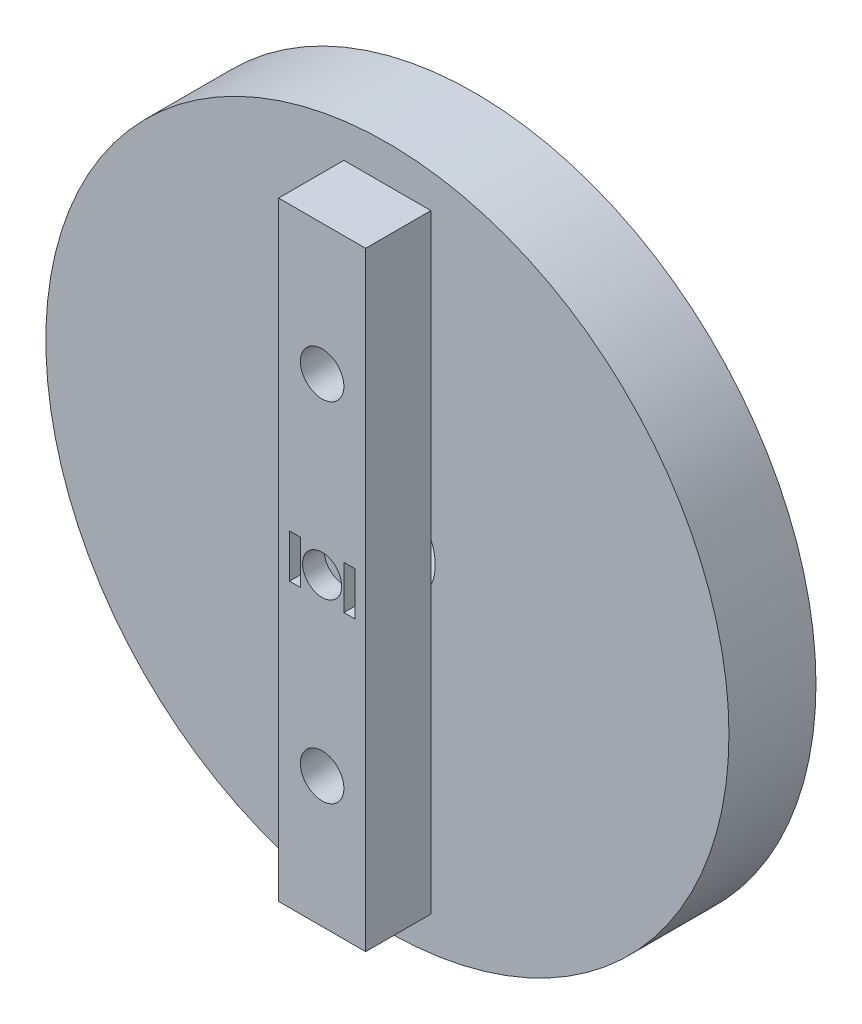
ISO-10303-21;
HEADER;
FILE_DESCRIPTION(('STEP AP214'),'2;1');
FILE_NAME('part.step','',(''),(''),'','','');
FILE_SCHEMA(('AUTOMOTIVE_DESIGN { 1 0 10303 214 1 1 1 1 }'));
ENDSEC;
DATA;
#1=APPLICATION_CONTEXT('core data for automotive mechanical design processes');
#2=APPLICATION_PROTOCOL_DEFINITION('international standard','automotive_design',2000,#1);
#3=PRODUCT_CONTEXT('',#1,'mechanical');
#4=PRODUCT('Part','Part','',(#3));
#5=PRODUCT_RELATED_PRODUCT_CATEGORY('part','',(#4));
#6=PRODUCT_DEFINITION_FORMATION('','',#4);
#7=PRODUCT_DEFINITION_CONTEXT('part definition',#1,'design');
#8=PRODUCT_DEFINITION('design','',#6,#7);
#9=PRODUCT_DEFINITION_SHAPE('','',#8);
#10=(LENGTH_UNIT() NAMED_UNIT(*) SI_UNIT(.MILLI.,.METRE.));
#11=(NAMED_UNIT(*) PLANE_ANGLE_UNIT() SI_UNIT($,.RADIAN.));
#12=(NAMED_UNIT(*) SI_UNIT($,.STERADIAN.) SOLID_ANGLE_UNIT());
#13=UNCERTAINTY_MEASURE_WITH_UNIT(LENGTH_MEASURE(1.E-05),#10,'distance_accuracy_value','');
#14=(GEOMETRIC_REPRESENTATION_CONTEXT(3) GLOBAL_UNCERTAINTY_ASSIGNED_CONTEXT((#13)) GLOBAL_UNIT_ASSIGNED_CONTEXT((#10,
#11,#12)) REPRESENTATION_CONTEXT('',''));
#15=CARTESIAN_POINT('',(0.,0.,0.));
#16=DIRECTION('',(0.,0.,1.));
#17=DIRECTION('',(1.,0.,0.));
#18=AXIS2_PLACEMENT_3D('',#15,#16,#17);
#19=CARTESIAN_POINT('',(0.,0.,7.));
#20=DIRECTION('',(0.,0.,1.));
#21=DIRECTION('',(1.,0.,0.));
#22=AXIS2_PLACEMENT_3D('',#19,#20,#21);
#23=PLANE('',#22);
#24=CARTESIAN_POINT('',(0.,8.,7.));
#25=DIRECTION('',(0.,0.,1.));
#26=DIRECTION('',(1.,0.,0.));
#27=AXIS2_PLACEMENT_3D('',#24,#25,#26);
#28=CIRCLE('',#27,1.);
#29=CARTESIAN_POINT('',(1.,8.,7.));
#30=VERTEX_POINT('',#29);
#31=EDGE_CURVE('E241',#30,#30,#28,.T.);
#32=ORIENTED_EDGE('',*,*,#31,.F.);
#33=EDGE_LOOP('',(#32));
#34=FACE_BOUND('',#33,.T.);
#35=CARTESIAN_POINT('',(0.,-8.,7.));
#36=DIRECTION('',(0.,0.,1.));
#37=DIRECTION('',(1.,0.,0.));
#38=AXIS2_PLACEMENT_3D('',#35,#36,#37);
#39=CIRCLE('',#38,1.);
#40=CARTESIAN_POINT('',(1.,-8.,7.));
#41=VERTEX_POINT('',#40);
#42=EDGE_CURVE('E159',#41,#41,#39,.T.);
#43=ORIENTED_EDGE('',*,*,#42,.F.);
#44=EDGE_LOOP('',(#43));
#45=FACE_BOUND('',#44,.T.);
#46=DIRECTION('',(1.,0.,0.));
#47=VECTOR('',#46,1.);
#48=CARTESIAN_POINT('',(1.,-1.,7.));
#49=LINE('',#48,#47);
#50=CARTESIAN_POINT('',(1.,-1.,7.));
#51=VERTEX_POINT('',#50);
#52=CARTESIAN_POINT('',(1.5,-1.,7.));
#53=VERTEX_POINT('',#52);
#54=EDGE_CURVE('E57',#51,#53,#49,.T.);
#55=ORIENTED_EDGE('',*,*,#54,.F.);
#56=DIRECTION('',(0.,-1.,0.));
#57=VECTOR('',#56,1.);
#58=CARTESIAN_POINT('',(1.,1.,7.));
#59=LINE('',#58,#57);
#60=CARTESIAN_POINT('',(1.,1.,7.));
#61=VERTEX_POINT('',#60);
#62=EDGE_CURVE('E153',#61,#51,#59,.T.);
#63=ORIENTED_EDGE('',*,*,#62,.F.);
#64=DIRECTION('',(1.,0.,0.));
#65=VECTOR('',#64,1.);
#66=CARTESIAN_POINT('',(1.,1.,7.));
#67=LINE('',#66,#65);
#68=CARTESIAN_POINT('',(1.5,1.,7.));
#69=VERTEX_POINT('',#68);
#70=EDGE_CURVE('E156',#61,#69,#67,.T.);
#71=ORIENTED_EDGE('',*,*,#70,.T.);
#72=DIRECTION('',(0.,-1.,0.));
#73=VECTOR('',#72,1.);
#74=CARTESIAN_POINT('',(1.5,1.,7.));
#75=LINE('',#74,#73);
#76=EDGE_CURVE('E165',#69,#53,#75,.T.);
#77=ORIENTED_EDGE('',*,*,#76,.T.);
#78=EDGE_LOOP('',(#55,#63,#71,#77));
#79=FACE_BOUND('',#78,.T.);
#80=CARTESIAN_POINT('',(0.,0.,7.));
#81=DIRECTION('',(0.,0.,1.));
#82=DIRECTION('',(1.,0.,0.));
#83=AXIS2_PLACEMENT_3D('',#80,#81,#82);
#84=CIRCLE('',#83,0.9);
#85=CARTESIAN_POINT('',(0.9,0.,7.));
#86=VERTEX_POINT('',#85);
#87=EDGE_CURVE('E206',#86,#86,#84,.T.);
#88=ORIENTED_EDGE('',*,*,#87,.F.);
#89=EDGE_LOOP('',(#88));
#90=FACE_BOUND('',#89,.T.);
#91=DIRECTION('',(0.,-1.,0.));
#92=VECTOR('',#91,1.);
#93=CARTESIAN_POINT('',(-2.,14.,7.));
#94=LINE('',#93,#92);
#95=CARTESIAN_POINT('',(-2.,14.,7.));
#96=VERTEX_POINT('',#95);
#97=CARTESIAN_POINT('',(-2.,-14.,7.));
#98=VERTEX_POINT('',#97);
#99=EDGE_CURVE('E215',#96,#98,#94,.T.);
#100=ORIENTED_EDGE('',*,*,#99,.T.);
#101=DIRECTION('',(1.,0.,0.));
#102=VECTOR('',#101,1.);
#103=CARTESIAN_POINT('',(-2.,-14.,7.));
#104=LINE('',#103,#102);
#105=CARTESIAN_POINT('',(2.,-14.,7.));
#106=VERTEX_POINT('',#105);
#107=EDGE_CURVE('E218',#98,#106,#104,.T.);
#108=ORIENTED_EDGE('',*,*,#107,.T.);
#109=DIRECTION('',(0.,1.,0.));
#110=VECTOR('',#109,1.);
#111=CARTESIAN_POINT('',(2.,14.,7.));
#112=LINE('',#111,#110);
#113=CARTESIAN_POINT('',(2.,14.,7.));
#114=VERTEX_POINT('',#113);
#115=EDGE_CURVE('E221',#106,#114,#112,.T.);
#116=ORIENTED_EDGE('',*,*,#115,.T.);
#117=DIRECTION('',(-1.,0.,0.));
#118=VECTOR('',#117,1.);
#119=CARTESIAN_POINT('',(-2.,14.,7.));
#120=LINE('',#119,#118);
#121=EDGE_CURVE('E223',#114,#96,#120,.T.);
#122=ORIENTED_EDGE('',*,*,#121,.T.);
#123=EDGE_LOOP('',(#100,#108,#116,#122));
#124=FACE_BOUND('',#123,.T.);
#125=DIRECTION('',(0.,-1.,0.));
#126=VECTOR('',#125,1.);
#127=CARTESIAN_POINT('',(-1.,1.,7.));
#128=LINE('',#127,#126);
#129=CARTESIAN_POINT('',(-1.,1.,7.));
#130=VERTEX_POINT('',#129);
#131=CARTESIAN_POINT('',(-1.,-1.,7.));
#132=VERTEX_POINT('',#131);
#133=EDGE_CURVE('E184',#130,#132,#128,.T.);
#134=ORIENTED_EDGE('',*,*,#133,.T.);
#135=DIRECTION('',(-1.,0.,0.));
#136=VECTOR('',#135,1.);
#137=CARTESIAN_POINT('',(-1.,-1.,7.));
#138=LINE('',#137,#136);
#139=CARTESIAN_POINT('',(-1.5,-1.,7.));
#140=VERTEX_POINT('',#139);
#141=EDGE_CURVE('E65',#132,#140,#138,.T.);
#142=ORIENTED_EDGE('',*,*,#141,.T.);
#143=DIRECTION('',(0.,-1.,0.));
#144=VECTOR('',#143,1.);
#145=CARTESIAN_POINT('',(-1.5,1.,7.));
#146=LINE('',#145,#144);
#147=CARTESIAN_POINT('',(-1.5,1.,7.));
#148=VERTEX_POINT('',#147);
#149=EDGE_CURVE('E191',#148,#140,#146,.T.);
#150=ORIENTED_EDGE('',*,*,#149,.F.);
#151=DIRECTION('',(-1.,0.,0.));
#152=VECTOR('',#151,1.);
#153=CARTESIAN_POINT('',(-1.,1.,7.));
#154=LINE('',#153,#152);
#155=EDGE_CURVE('E187',#130,#148,#154,.T.);
#156=ORIENTED_EDGE('',*,*,#155,.F.);
#157=EDGE_LOOP('',(#134,#142,#150,#156));
#158=FACE_BOUND('',#157,.T.);
#159=ADVANCED_FACE('F40',(#34,#45,#79,#90,#124,#158),#23,.T.);
#160=CARTESIAN_POINT('',(0.,0.,4.));
#161=DIRECTION('',(0.,0.,1.));
#162=DIRECTION('',(1.,0.,0.));
#163=AXIS2_PLACEMENT_3D('',#160,#161,#162);
#164=PLANE('',#163);
#165=CARTESIAN_POINT('',(0.,8.,4.));
#166=DIRECTION('',(0.,0.,1.));
#167=DIRECTION('',(1.,0.,0.));
#168=AXIS2_PLACEMENT_3D('',#165,#166,#167);
#169=CIRCLE('',#168,1.);
#170=CARTESIAN_POINT('',(1.,8.,4.));
#171=VERTEX_POINT('',#170);
#172=EDGE_CURVE('E44',#171,#171,#169,.T.);
#173=ORIENTED_EDGE('',*,*,#172,.T.);
#174=EDGE_LOOP('',(#173));
#175=FACE_BOUND('',#174,.T.);
#176=CARTESIAN_POINT('',(0.,-8.,4.));
#177=DIRECTION('',(0.,0.,1.));
#178=DIRECTION('',(1.,0.,0.));
#179=AXIS2_PLACEMENT_3D('',#176,#177,#178);
#180=CIRCLE('',#179,1.);
#181=CARTESIAN_POINT('',(1.,-8.,4.));
#182=VERTEX_POINT('',#181);
#183=EDGE_CURVE('E239',#182,#182,#180,.T.);
#184=ORIENTED_EDGE('',*,*,#183,.T.);
#185=EDGE_LOOP('',(#184));
#186=FACE_BOUND('',#185,.T.);
#187=DIRECTION('',(0.,-1.,0.));
#188=VECTOR('',#187,1.);
#189=CARTESIAN_POINT('',(1.,1.,4.));
#190=LINE('',#189,#188);
#191=CARTESIAN_POINT('',(1.,1.,4.));
#192=VERTEX_POINT('',#191);
#193=CARTESIAN_POINT('',(1.,-1.,4.));
#194=VERTEX_POINT('',#193);
#195=EDGE_CURVE('E148',#192,#194,#190,.T.);
#196=ORIENTED_EDGE('',*,*,#195,.T.);
#197=DIRECTION('',(1.,0.,0.));
#198=VECTOR('',#197,1.);
#199=CARTESIAN_POINT('',(1.,-1.,4.));
#200=LINE('',#199,#198);
#201=CARTESIAN_POINT('',(1.5,-1.,4.));
#202=VERTEX_POINT('',#201);
#203=EDGE_CURVE('E143',#194,#202,#200,.T.);
#204=ORIENTED_EDGE('',*,*,#203,.T.);
#205=DIRECTION('',(0.,-1.,0.));
#206=VECTOR('',#205,1.);
#207=CARTESIAN_POINT('',(1.5,1.,4.));
#208=LINE('',#207,#206);
#209=CARTESIAN_POINT('',(1.5,1.,4.));
#210=VERTEX_POINT('',#209);
#211=EDGE_CURVE('E132',#210,#202,#208,.T.);
#212=ORIENTED_EDGE('',*,*,#211,.F.);
#213=DIRECTION('',(1.,0.,0.));
#214=VECTOR('',#213,1.);
#215=CARTESIAN_POINT('',(1.,1.,4.));
#216=LINE('',#215,#214);
#217=EDGE_CURVE('E142',#192,#210,#216,.T.);
#218=ORIENTED_EDGE('',*,*,#217,.F.);
#219=EDGE_LOOP('',(#196,#204,#212,#218));
#220=FACE_BOUND('',#219,.T.);
#221=DIRECTION('',(0.,-1.,0.));
#222=VECTOR('',#221,1.);
#223=CARTESIAN_POINT('',(-2.,14.,4.));
#224=LINE('',#223,#222);
#225=CARTESIAN_POINT('',(-2.,14.,4.));
#226=VERTEX_POINT('',#225);
#227=CARTESIAN_POINT('',(-2.,-14.,4.));
#228=VERTEX_POINT('',#227);
#229=EDGE_CURVE('E212',#226,#228,#224,.T.);
#230=ORIENTED_EDGE('',*,*,#229,.F.);
#231=DIRECTION('',(-1.,0.,0.));
#232=VECTOR('',#231,1.);
#233=CARTESIAN_POINT('',(-2.,14.,4.));
#234=LINE('',#233,#232);
#235=CARTESIAN_POINT('',(2.,14.,4.));
#236=VERTEX_POINT('',#235);
#237=EDGE_CURVE('E219',#236,#226,#234,.T.);
#238=ORIENTED_EDGE('',*,*,#237,.F.);
#239=DIRECTION('',(0.,1.,0.));
#240=VECTOR('',#239,1.);
#241=CARTESIAN_POINT('',(2.,14.,4.));
#242=LINE('',#241,#240);
#243=CARTESIAN_POINT('',(2.,-14.,4.));
#244=VERTEX_POINT('',#243);
#245=EDGE_CURVE('E230',#244,#236,#242,.T.);
#246=ORIENTED_EDGE('',*,*,#245,.F.);
#247=DIRECTION('',(1.,0.,0.));
#248=VECTOR('',#247,1.);
#249=CARTESIAN_POINT('',(-2.,-14.,4.));
#250=LINE('',#249,#248);
#251=EDGE_CURVE('E228',#228,#244,#250,.T.);
#252=ORIENTED_EDGE('',*,*,#251,.F.);
#253=EDGE_LOOP('',(#230,#238,#246,#252));
#254=FACE_BOUND('',#253,.T.);
#255=CARTESIAN_POINT('',(0.,0.,4.));
#256=DIRECTION('',(0.,0.,1.));
#257=DIRECTION('',(1.,0.,0.));
#258=AXIS2_PLACEMENT_3D('',#255,#256,#257);
#259=CIRCLE('',#258,0.4);
#260=CARTESIAN_POINT('',(0.4,0.,4.));
#261=VERTEX_POINT('',#260);
#262=EDGE_CURVE('E203',#261,#261,#259,.T.);
#263=ORIENTED_EDGE('',*,*,#262,.T.);
#264=EDGE_LOOP('',(#263));
#265=FACE_BOUND('',#264,.T.);
#266=DIRECTION('',(-1.,0.,0.));
#267=VECTOR('',#266,1.);
#268=CARTESIAN_POINT('',(-1.,-1.,4.));
#269=LINE('',#268,#267);
#270=CARTESIAN_POINT('',(-1.,-1.,4.));
#271=VERTEX_POINT('',#270);
#272=CARTESIAN_POINT('',(-1.5,-1.,4.));
#273=VERTEX_POINT('',#272);
#274=EDGE_CURVE('E188',#271,#273,#269,.T.);
#275=ORIENTED_EDGE('',*,*,#274,.F.);
#276=DIRECTION('',(0.,-1.,0.));
#277=VECTOR('',#276,1.);
#278=CARTESIAN_POINT('',(-1.,1.,4.));
#279=LINE('',#278,#277);
#280=CARTESIAN_POINT('',(-1.,1.,4.));
#281=VERTEX_POINT('',#280);
#282=EDGE_CURVE('E183',#281,#271,#279,.T.);
#283=ORIENTED_EDGE('',*,*,#282,.F.);
#284=DIRECTION('',(-1.,0.,0.));
#285=VECTOR('',#284,1.);
#286=CARTESIAN_POINT('',(-1.,1.,4.));
#287=LINE('',#286,#285);
#288=CARTESIAN_POINT('',(-1.5,1.,4.));
#289=VERTEX_POINT('',#288);
#290=EDGE_CURVE('E196',#281,#289,#287,.T.);
#291=ORIENTED_EDGE('',*,*,#290,.T.);
#292=DIRECTION('',(0.,-1.,0.));
#293=VECTOR('',#292,1.);
#294=CARTESIAN_POINT('',(-1.5,1.,4.));
#295=LINE('',#294,#293);
#296=EDGE_CURVE('E199',#289,#273,#295,.T.);
#297=ORIENTED_EDGE('',*,*,#296,.T.);
#298=EDGE_LOOP('',(#275,#283,#291,#297));
#299=FACE_BOUND('',#298,.T.);
#300=ADVANCED_FACE('F150',(#175,#186,#220,#254,#265,#299),#164,.F.);
#301=CARTESIAN_POINT('',(-2.,14.,7.));
#302=DIRECTION('',(1.,0.,0.));
#303=DIRECTION('',(0.,0.,-1.));
#304=AXIS2_PLACEMENT_3D('',#301,#302,#303);
#305=PLANE('',#304);
#306=ORIENTED_EDGE('',*,*,#229,.T.);
#307=DIRECTION('',(0.,0.,-1.));
#308=VECTOR('',#307,1.);
#309=CARTESIAN_POINT('',(-2.,-14.,7.));
#310=LINE('',#309,#308);
#311=EDGE_CURVE('E12',#98,#228,#310,.T.);
#312=ORIENTED_EDGE('',*,*,#311,.F.);
#313=ORIENTED_EDGE('',*,*,#99,.F.);
#314=DIRECTION('',(0.,0.,-1.));
#315=VECTOR('',#314,1.);
#316=CARTESIAN_POINT('',(-2.,14.,7.));
#317=LINE('',#316,#315);
#318=EDGE_CURVE('E225',#96,#226,#317,.T.);
#319=ORIENTED_EDGE('',*,*,#318,.T.);
#320=EDGE_LOOP('',(#306,#312,#313,#319));
#321=FACE_BOUND('',#320,.T.);
#322=ADVANCED_FACE('F42',(#321),#305,.F.);
#323=CARTESIAN_POINT('',(-2.,-14.,7.));
#324=DIRECTION('',(0.,1.,0.));
#325=DIRECTION('',(0.,0.,1.));
#326=AXIS2_PLACEMENT_3D('',#323,#324,#325);
#327=PLANE('',#326);
#328=ORIENTED_EDGE('',*,*,#251,.T.);
#329=DIRECTION('',(0.,0.,-1.));
#330=VECTOR('',#329,1.);
#331=CARTESIAN_POINT('',(2.,-14.,7.));
#332=LINE('',#331,#330);
#333=EDGE_CURVE('E49',#106,#244,#332,.T.);
#334=ORIENTED_EDGE('',*,*,#333,.F.);
#335=ORIENTED_EDGE('',*,*,#107,.F.);
#336=ORIENTED_EDGE('',*,*,#311,.T.);
#337=EDGE_LOOP('',(#328,#334,#335,#336));
#338=FACE_BOUND('',#337,.T.);
#339=ADVANCED_FACE('F312',(#338),#327,.F.);
#340=CARTESIAN_POINT('',(2.,14.,7.));
#341=DIRECTION('',(-1.,0.,0.));
#342=DIRECTION('',(0.,-1.,0.));
#343=AXIS2_PLACEMENT_3D('',#340,#341,#342);
#344=PLANE('',#343);
#345=ORIENTED_EDGE('',*,*,#245,.T.);
#346=DIRECTION('',(0.,0.,-1.));
#347=VECTOR('',#346,1.);
#348=CARTESIAN_POINT('',(2.,14.,7.));
#349=LINE('',#348,#347);
#350=EDGE_CURVE('E235',#114,#236,#349,.T.);
#351=ORIENTED_EDGE('',*,*,#350,.F.);
#352=ORIENTED_EDGE('',*,*,#115,.F.);
#353=ORIENTED_EDGE('',*,*,#333,.T.);
#354=EDGE_LOOP('',(#345,#351,#352,#353));
#355=FACE_BOUND('',#354,.T.);
#356=ADVANCED_FACE('F309',(#355),#344,.F.);
#357=CARTESIAN_POINT('',(-2.,14.,7.));
#358=DIRECTION('',(0.,-1.,0.));
#359=DIRECTION('',(0.,0.,-1.));
#360=AXIS2_PLACEMENT_3D('',#357,#358,#359);
#361=PLANE('',#360);
#362=ORIENTED_EDGE('',*,*,#237,.T.);
#363=ORIENTED_EDGE('',*,*,#318,.F.);
#364=ORIENTED_EDGE('',*,*,#121,.F.);
#365=ORIENTED_EDGE('',*,*,#350,.T.);
#366=EDGE_LOOP('',(#362,#363,#364,#365));
#367=FACE_BOUND('',#366,.T.);
#368=ADVANCED_FACE('F301',(#367),#361,.F.);
#369=CARTESIAN_POINT('',(0.,0.,6.));
#370=DIRECTION('',(0.,0.,1.));
#371=DIRECTION('',(1.,0.,0.));
#372=AXIS2_PLACEMENT_3D('',#369,#370,#371);
#373=CYLINDRICAL_SURFACE('',#372,0.9);
#374=CARTESIAN_POINT('',(0.,0.,6.));
#375=DIRECTION('',(0.,0.,1.));
#376=DIRECTION('',(1.,0.,0.));
#377=AXIS2_PLACEMENT_3D('',#374,#375,#376);
#378=CIRCLE('',#377,0.9);
#379=CARTESIAN_POINT('',(0.9,0.,6.));
#380=VERTEX_POINT('',#379);
#381=EDGE_CURVE('E209',#380,#380,#378,.T.);
#382=ORIENTED_EDGE('',*,*,#381,.F.);
#383=EDGE_LOOP('',(#382));
#384=FACE_BOUND('',#383,.T.);
#385=ORIENTED_EDGE('',*,*,#87,.T.);
#386=EDGE_LOOP('',(#385));
#387=FACE_BOUND('',#386,.T.);
#388=ADVANCED_FACE('F298',(#384,#387),#373,.F.);
#389=CARTESIAN_POINT('',(0.,0.,6.));
#390=DIRECTION('',(0.,0.,1.));
#391=DIRECTION('',(1.,0.,0.));
#392=AXIS2_PLACEMENT_3D('',#389,#390,#391);
#393=PLANE('',#392);
#394=CARTESIAN_POINT('',(0.,0.,6.));
#395=DIRECTION('',(0.,0.,1.));
#396=DIRECTION('',(1.,0.,0.));
#397=AXIS2_PLACEMENT_3D('',#394,#395,#396);
#398=CIRCLE('',#397,0.4);
#399=CARTESIAN_POINT('',(0.4,0.,6.));
#400=VERTEX_POINT('',#399);
#401=EDGE_CURVE('E171',#400,#400,#398,.T.);
#402=ORIENTED_EDGE('',*,*,#401,.F.);
#403=EDGE_LOOP('',(#402));
#404=FACE_BOUND('',#403,.T.);
#405=ORIENTED_EDGE('',*,*,#381,.T.);
#406=EDGE_LOOP('',(#405));
#407=FACE_BOUND('',#406,.T.);
#408=ADVANCED_FACE('F294',(#404,#407),#393,.T.);
#409=CARTESIAN_POINT('',(0.,0.,4.));
#410=DIRECTION('',(0.,0.,1.));
#411=DIRECTION('',(1.,0.,0.));
#412=AXIS2_PLACEMENT_3D('',#409,#410,#411);
#413=CYLINDRICAL_SURFACE('',#412,0.4);
#414=ORIENTED_EDGE('',*,*,#262,.F.);
#415=EDGE_LOOP('',(#414));
#416=FACE_BOUND('',#415,.T.);
#417=ORIENTED_EDGE('',*,*,#401,.T.);
#418=EDGE_LOOP('',(#417));
#419=FACE_BOUND('',#418,.T.);
#420=ADVANCED_FACE('F291',(#416,#419),#413,.F.);
#421=CARTESIAN_POINT('',(-1.,-1.,4.));
#422=DIRECTION('',(0.,1.,0.));
#423=DIRECTION('',(0.,0.,1.));
#424=AXIS2_PLACEMENT_3D('',#421,#422,#423);
#425=PLANE('',#424);
#426=ORIENTED_EDGE('',*,*,#141,.F.);
#427=DIRECTION('',(0.,0.,1.));
#428=VECTOR('',#427,1.);
#429=CARTESIAN_POINT('',(-1.,-1.,4.));
#430=LINE('',#429,#428);
#431=EDGE_CURVE('E181',#271,#132,#430,.T.);
#432=ORIENTED_EDGE('',*,*,#431,.F.);
#433=ORIENTED_EDGE('',*,*,#274,.T.);
#434=DIRECTION('',(0.,0.,1.));
#435=VECTOR('',#434,1.);
#436=CARTESIAN_POINT('',(-1.5,-1.,4.));
#437=LINE('',#436,#435);
#438=EDGE_CURVE('E175',#273,#140,#437,.T.);
#439=ORIENTED_EDGE('',*,*,#438,.T.);
#440=EDGE_LOOP('',(#426,#432,#433,#439));
#441=FACE_BOUND('',#440,.T.);
#442=ADVANCED_FACE('F273',(#441),#425,.T.);
#443=CARTESIAN_POINT('',(-1.5,1.,4.));
#444=DIRECTION('',(-1.,0.,0.));
#445=DIRECTION('',(0.,-1.,0.));
#446=AXIS2_PLACEMENT_3D('',#443,#444,#445);
#447=PLANE('',#446);
#448=ORIENTED_EDGE('',*,*,#149,.T.);
#449=ORIENTED_EDGE('',*,*,#438,.F.);
#450=ORIENTED_EDGE('',*,*,#296,.F.);
#451=DIRECTION('',(0.,0.,1.));
#452=VECTOR('',#451,1.);
#453=CARTESIAN_POINT('',(-1.5,1.,4.));
#454=LINE('',#453,#452);
#455=EDGE_CURVE('E177',#289,#148,#454,.T.);
#456=ORIENTED_EDGE('',*,*,#455,.T.);
#457=EDGE_LOOP('',(#448,#449,#450,#456));
#458=FACE_BOUND('',#457,.T.);
#459=ADVANCED_FACE('F278',(#458),#447,.F.);
#460=CARTESIAN_POINT('',(-1.,1.,4.));
#461=DIRECTION('',(0.,1.,0.));
#462=DIRECTION('',(0.,0.,1.));
#463=AXIS2_PLACEMENT_3D('',#460,#461,#462);
#464=PLANE('',#463);
#465=ORIENTED_EDGE('',*,*,#155,.T.);
#466=ORIENTED_EDGE('',*,*,#455,.F.);
#467=ORIENTED_EDGE('',*,*,#290,.F.);
#468=DIRECTION('',(0.,0.,1.));
#469=VECTOR('',#468,1.);
#470=CARTESIAN_POINT('',(-1.,1.,4.));
#471=LINE('',#470,#469);
#472=EDGE_CURVE('E179',#281,#130,#471,.T.);
#473=ORIENTED_EDGE('',*,*,#472,.T.);
#474=EDGE_LOOP('',(#465,#466,#467,#473));
#475=FACE_BOUND('',#474,.T.);
#476=ADVANCED_FACE('F280',(#475),#464,.F.);
#477=CARTESIAN_POINT('',(-1.,1.,4.));
#478=DIRECTION('',(-1.,0.,0.));
#479=DIRECTION('',(0.,-1.,0.));
#480=AXIS2_PLACEMENT_3D('',#477,#478,#479);
#481=PLANE('',#480);
#482=ORIENTED_EDGE('',*,*,#133,.F.);
#483=ORIENTED_EDGE('',*,*,#472,.F.);
#484=ORIENTED_EDGE('',*,*,#282,.T.);
#485=ORIENTED_EDGE('',*,*,#431,.T.);
#486=EDGE_LOOP('',(#482,#483,#484,#485));
#487=FACE_BOUND('',#486,.T.);
#488=ADVANCED_FACE('F270',(#487),#481,.T.);
#489=CARTESIAN_POINT('',(1.,-1.,4.));
#490=DIRECTION('',(0.,-1.,0.));
#491=DIRECTION('',(1.,0.,0.));
#492=AXIS2_PLACEMENT_3D('',#489,#490,#491);
#493=PLANE('',#492);
#494=ORIENTED_EDGE('',*,*,#54,.T.);
#495=DIRECTION('',(0.,0.,1.));
#496=VECTOR('',#495,1.);
#497=CARTESIAN_POINT('',(1.5,-1.,4.));
#498=LINE('',#497,#496);
#499=EDGE_CURVE('E135',#202,#53,#498,.T.);
#500=ORIENTED_EDGE('',*,*,#499,.F.);
#501=ORIENTED_EDGE('',*,*,#203,.F.);
#502=DIRECTION('',(0.,0.,1.));
#503=VECTOR('',#502,1.);
#504=CARTESIAN_POINT('',(1.,-1.,4.));
#505=LINE('',#504,#503);
#506=EDGE_CURVE('E169',#194,#51,#505,.T.);
#507=ORIENTED_EDGE('',*,*,#506,.T.);
#508=EDGE_LOOP('',(#494,#500,#501,#507));
#509=FACE_BOUND('',#508,.T.);
#510=ADVANCED_FACE('F146',(#509),#493,.F.);
#511=CARTESIAN_POINT('',(1.,1.,4.));
#512=DIRECTION('',(-1.,0.,0.));
#513=DIRECTION('',(0.,0.,1.));
#514=AXIS2_PLACEMENT_3D('',#511,#512,#513);
#515=PLANE('',#514);
#516=ORIENTED_EDGE('',*,*,#62,.T.);
#517=ORIENTED_EDGE('',*,*,#506,.F.);
#518=ORIENTED_EDGE('',*,*,#195,.F.);
#519=DIRECTION('',(0.,0.,1.));
#520=VECTOR('',#519,1.);
#521=CARTESIAN_POINT('',(1.,1.,4.));
#522=LINE('',#521,#520);
#523=EDGE_CURVE('E172',#192,#61,#522,.T.);
#524=ORIENTED_EDGE('',*,*,#523,.T.);
#525=EDGE_LOOP('',(#516,#517,#518,#524));
#526=FACE_BOUND('',#525,.T.);
#527=ADVANCED_FACE('F367',(#526),#515,.F.);
#528=CARTESIAN_POINT('',(1.,1.,4.));
#529=DIRECTION('',(0.,-1.,0.));
#530=DIRECTION('',(0.,0.,-1.));
#531=AXIS2_PLACEMENT_3D('',#528,#529,#530);
#532=PLANE('',#531);
#533=ORIENTED_EDGE('',*,*,#70,.F.);
#534=ORIENTED_EDGE('',*,*,#523,.F.);
#535=ORIENTED_EDGE('',*,*,#217,.T.);
#536=DIRECTION('',(0.,0.,1.));
#537=VECTOR('',#536,1.);
#538=CARTESIAN_POINT('',(1.5,1.,4.));
#539=LINE('',#538,#537);
#540=EDGE_CURVE('E137',#210,#69,#539,.T.);
#541=ORIENTED_EDGE('',*,*,#540,.T.);
#542=EDGE_LOOP('',(#533,#534,#535,#541));
#543=FACE_BOUND('',#542,.T.);
#544=ADVANCED_FACE('F356',(#543),#532,.T.);
#545=CARTESIAN_POINT('',(1.5,1.,4.));
#546=DIRECTION('',(-1.,0.,0.));
#547=DIRECTION('',(0.,0.,1.));
#548=AXIS2_PLACEMENT_3D('',#545,#546,#547);
#549=PLANE('',#548);
#550=ORIENTED_EDGE('',*,*,#76,.F.);
#551=ORIENTED_EDGE('',*,*,#540,.F.);
#552=ORIENTED_EDGE('',*,*,#211,.T.);
#553=ORIENTED_EDGE('',*,*,#499,.T.);
#554=EDGE_LOOP('',(#550,#551,#552,#553));
#555=FACE_BOUND('',#554,.T.);
#556=ADVANCED_FACE('F134',(#555),#549,.T.);
#557=CARTESIAN_POINT('',(0.,-8.,2.));
#558=DIRECTION('',(0.,0.,1.));
#559=DIRECTION('',(1.,0.,0.));
#560=AXIS2_PLACEMENT_3D('',#557,#558,#559);
#561=CYLINDRICAL_SURFACE('',#560,1.);
#562=ORIENTED_EDGE('',*,*,#42,.T.);
#563=EDGE_LOOP('',(#562));
#564=FACE_BOUND('',#563,.T.);
#565=ORIENTED_EDGE('',*,*,#183,.F.);
#566=EDGE_LOOP('',(#565));
#567=FACE_BOUND('',#566,.T.);
#568=ADVANCED_FACE('F251',(#564,#567),#561,.F.);
#569=CARTESIAN_POINT('',(0.,8.,2.));
#570=DIRECTION('',(0.,0.,1.));
#571=DIRECTION('',(1.,0.,0.));
#572=AXIS2_PLACEMENT_3D('',#569,#570,#571);
#573=CYLINDRICAL_SURFACE('',#572,1.);
#574=ORIENTED_EDGE('',*,*,#31,.T.);
#575=EDGE_LOOP('',(#574));
#576=FACE_BOUND('',#575,.T.);
#577=ORIENTED_EDGE('',*,*,#172,.F.);
#578=EDGE_LOOP('',(#577));
#579=FACE_BOUND('',#578,.T.);
#580=ADVANCED_FACE('F451',(#576,#579),#573,.F.);
#581=CLOSED_SHELL('',(#159,#300,#322,#339,#356,#368,#388,#408,#420,#442,#459,#476,#488,#510,
#527,#544,#556,#568,#580));
#582=MANIFOLD_SOLID_BREP('B2',#581);
#583=CARTESIAN_POINT('',(0.,0.,4.));
#584=DIRECTION('',(0.,0.,-1.));
#585=DIRECTION('',(-1.,0.,0.));
#586=AXIS2_PLACEMENT_3D('',#583,#584,#585);
#587=CYLINDRICAL_SURFACE('',#586,15.7);
#588=CARTESIAN_POINT('',(0.,0.,4.));
#589=DIRECTION('',(0.,0.,1.));
#590=DIRECTION('',(1.,0.,0.));
#591=AXIS2_PLACEMENT_3D('',#588,#589,#590);
#592=CIRCLE('',#591,15.7);
#593=CARTESIAN_POINT('',(15.7,0.,4.));
#594=VERTEX_POINT('',#593);
#595=EDGE_CURVE('E39',#594,#594,#592,.T.);
#596=ORIENTED_EDGE('',*,*,#595,.F.);
#597=EDGE_LOOP('',(#596));
#598=FACE_BOUND('',#597,.T.);
#599=CARTESIAN_POINT('',(0.,0.,0.));
#600=DIRECTION('',(0.,0.,1.));
#601=DIRECTION('',(1.,0.,0.));
#602=AXIS2_PLACEMENT_3D('',#599,#600,#601);
#603=CIRCLE('',#602,15.7);
#604=CARTESIAN_POINT('',(15.7,0.,0.));
#605=VERTEX_POINT('',#604);
#606=EDGE_CURVE('E475',#605,#605,#603,.T.);
#607=ORIENTED_EDGE('',*,*,#606,.T.);
#608=EDGE_LOOP('',(#607));
#609=FACE_BOUND('',#608,.T.);
#610=ADVANCED_FACE('F468',(#598,#609),#587,.T.);
#611=CARTESIAN_POINT('',(0.,0.,4.));
#612=DIRECTION('',(0.,0.,1.));
#613=DIRECTION('',(1.,0.,0.));
#614=AXIS2_PLACEMENT_3D('',#611,#612,#613);
#615=PLANE('',#614);
#616=CARTESIAN_POINT('',(0.,8.,4.));
#617=DIRECTION('',(0.,0.,1.));
#618=DIRECTION('',(1.,0.,0.));
#619=AXIS2_PLACEMENT_3D('',#616,#617,#618);
#620=CIRCLE('',#619,1.);
#621=CARTESIAN_POINT('',(1.,8.,4.));
#622=VERTEX_POINT('',#621);
#623=EDGE_CURVE('E471',#622,#622,#620,.T.);
#624=ORIENTED_EDGE('',*,*,#623,.F.);
#625=EDGE_LOOP('',(#624));
#626=FACE_BOUND('',#625,.T.);
#627=CARTESIAN_POINT('',(0.,-8.,4.));
#628=DIRECTION('',(0.,0.,1.));
#629=DIRECTION('',(1.,0.,0.));
#630=AXIS2_PLACEMENT_3D('',#627,#628,#629);
#631=CIRCLE('',#630,1.);
#632=CARTESIAN_POINT('',(1.,-8.,4.));
#633=VERTEX_POINT('',#632);
#634=EDGE_CURVE('E485',#633,#633,#631,.T.);
#635=ORIENTED_EDGE('',*,*,#634,.F.);
#636=EDGE_LOOP('',(#635));
#637=FACE_BOUND('',#636,.T.);
#638=CARTESIAN_POINT('',(0.,0.,4.));
#639=DIRECTION('',(0.,0.,-1.));
#640=DIRECTION('',(-1.,0.,0.));
#641=AXIS2_PLACEMENT_3D('',#638,#639,#640);
#642=CIRCLE('',#641,2.2);
#643=CARTESIAN_POINT('',(-2.2,0.,4.));
#644=VERTEX_POINT('',#643);
#645=EDGE_CURVE('E480',#644,#644,#642,.T.);
#646=ORIENTED_EDGE('',*,*,#645,.T.);
#647=EDGE_LOOP('',(#646));
#648=FACE_BOUND('',#647,.T.);
#649=ORIENTED_EDGE('',*,*,#595,.T.);
#650=EDGE_LOOP('',(#649));
#651=FACE_BOUND('',#650,.T.);
#652=ADVANCED_FACE('F509',(#626,#637,#648,#651),#615,.T.);
#653=CARTESIAN_POINT('',(0.,0.,0.));
#654=DIRECTION('',(0.,0.,1.));
#655=DIRECTION('',(1.,0.,0.));
#656=AXIS2_PLACEMENT_3D('',#653,#654,#655);
#657=PLANE('',#656);
#658=CARTESIAN_POINT('',(0.,0.,0.));
#659=DIRECTION('',(0.,0.,-1.));
#660=DIRECTION('',(-1.,0.,0.));
#661=AXIS2_PLACEMENT_3D('',#658,#659,#660);
#662=CIRCLE('',#661,2.2);
#663=CARTESIAN_POINT('',(-2.2,0.,0.));
#664=VERTEX_POINT('',#663);
#665=EDGE_CURVE('E483',#664,#664,#662,.T.);
#666=ORIENTED_EDGE('',*,*,#665,.F.);
#667=EDGE_LOOP('',(#666));
#668=FACE_BOUND('',#667,.T.);
#669=ORIENTED_EDGE('',*,*,#606,.F.);
#670=EDGE_LOOP('',(#669));
#671=FACE_BOUND('',#670,.T.);
#672=ADVANCED_FACE('F506',(#668,#671),#657,.F.);
#673=CARTESIAN_POINT('',(0.,0.,4.));
#674=DIRECTION('',(0.,0.,-1.));
#675=DIRECTION('',(-1.,0.,0.));
#676=AXIS2_PLACEMENT_3D('',#673,#674,#675);
#677=CYLINDRICAL_SURFACE('',#676,2.2);
#678=ORIENTED_EDGE('',*,*,#645,.F.);
#679=EDGE_LOOP('',(#678));
#680=FACE_BOUND('',#679,.T.);
#681=ORIENTED_EDGE('',*,*,#665,.T.);
#682=EDGE_LOOP('',(#681));
#683=FACE_BOUND('',#682,.T.);
#684=ADVANCED_FACE('F504',(#680,#683),#677,.F.);
#685=CARTESIAN_POINT('',(0.,-8.,2.));
#686=DIRECTION('',(0.,0.,1.));
#687=DIRECTION('',(1.,0.,0.));
#688=AXIS2_PLACEMENT_3D('',#685,#686,#687);
#689=CYLINDRICAL_SURFACE('',#688,1.);
#690=ORIENTED_EDGE('',*,*,#634,.T.);
#691=EDGE_LOOP('',(#690));
#692=FACE_BOUND('',#691,.T.);
#693=CARTESIAN_POINT('',(0.,-8.,2.));
#694=DIRECTION('',(0.,0.,1.));
#695=DIRECTION('',(1.,0.,0.));
#696=AXIS2_PLACEMENT_3D('',#693,#694,#695);
#697=CIRCLE('',#696,1.);
#698=CARTESIAN_POINT('',(1.,-8.,2.));
#699=VERTEX_POINT('',#698);
#700=EDGE_CURVE('E492',#699,#699,#697,.T.);
#701=ORIENTED_EDGE('',*,*,#700,.F.);
#702=EDGE_LOOP('',(#701));
#703=FACE_BOUND('',#702,.T.);
#704=ADVANCED_FACE('F526',(#692,#703),#689,.F.);
#705=CARTESIAN_POINT('',(0.,-8.,2.));
#706=DIRECTION('',(0.,0.,1.));
#707=DIRECTION('',(1.,0.,0.));
#708=AXIS2_PLACEMENT_3D('',#705,#706,#707);
#709=PLANE('',#708);
#710=ORIENTED_EDGE('',*,*,#700,.T.);
#711=EDGE_LOOP('',(#710));
#712=FACE_BOUND('',#711,.T.);
#713=ADVANCED_FACE('F530',(#712),#709,.T.);
#714=CARTESIAN_POINT('',(0.,8.,2.));
#715=DIRECTION('',(0.,0.,1.));
#716=DIRECTION('',(1.,0.,0.));
#717=AXIS2_PLACEMENT_3D('',#714,#715,#716);
#718=CYLINDRICAL_SURFACE('',#717,1.);
#719=ORIENTED_EDGE('',*,*,#623,.T.);
#720=EDGE_LOOP('',(#719));
#721=FACE_BOUND('',#720,.T.);
#722=CARTESIAN_POINT('',(0.,8.,2.));
#723=DIRECTION('',(0.,0.,1.));
#724=DIRECTION('',(1.,0.,0.));
#725=AXIS2_PLACEMENT_3D('',#722,#723,#724);
#726=CIRCLE('',#725,1.);
#727=CARTESIAN_POINT('',(1.,8.,2.));
#728=VERTEX_POINT('',#727);
#729=EDGE_CURVE('E487',#728,#728,#726,.T.);
#730=ORIENTED_EDGE('',*,*,#729,.F.);
#731=EDGE_LOOP('',(#730));
#732=FACE_BOUND('',#731,.T.);
#733=ADVANCED_FACE('F533',(#721,#732),#718,.F.);
#734=CARTESIAN_POINT('',(0.,8.,2.));
#735=DIRECTION('',(0.,0.,1.));
#736=DIRECTION('',(1.,0.,0.));
#737=AXIS2_PLACEMENT_3D('',#734,#735,#736);
#738=PLANE('',#737);
#739=ORIENTED_EDGE('',*,*,#729,.T.);
#740=EDGE_LOOP('',(#739));
#741=FACE_BOUND('',#740,.T.);
#742=ADVANCED_FACE('F537',(#741),#738,.T.);
#743=CLOSED_SHELL('',(#610,#652,#672,#684,#704,#713,#733,#742));
#744=MANIFOLD_SOLID_BREP('B6',#743);
#745=ADVANCED_BREP_SHAPE_REPRESENTATION('',(#18,#582,#744),#14);
#746=SHAPE_DEFINITION_REPRESENTATION(#9,#745);
ENDSEC;
END-ISO-10303-21;
